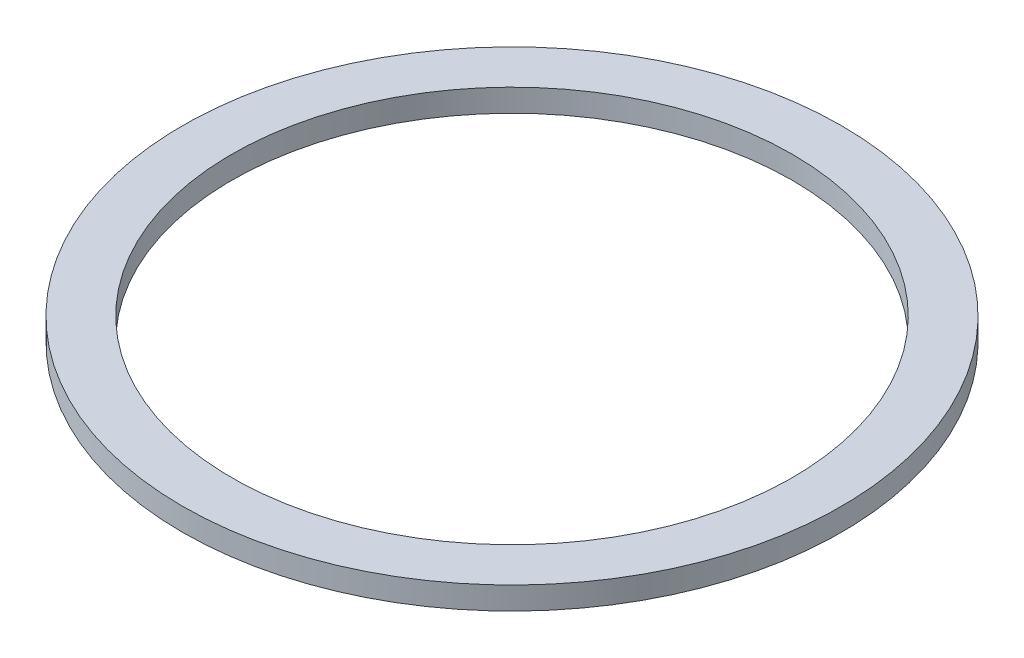
ISO-10303-21;
HEADER;
FILE_DESCRIPTION(('STEP AP214'),'2;1');
FILE_NAME('part.step','',(''),(''),'','','');
FILE_SCHEMA(('AUTOMOTIVE_DESIGN { 1 0 10303 214 1 1 1 1 }'));
ENDSEC;
DATA;
#1=APPLICATION_CONTEXT('core data for automotive mechanical design processes');
#2=APPLICATION_PROTOCOL_DEFINITION('international standard','automotive_design',2000,#1);
#3=PRODUCT_CONTEXT('',#1,'mechanical');
#4=PRODUCT('Part','Part','',(#3));
#5=PRODUCT_RELATED_PRODUCT_CATEGORY('part','',(#4));
#6=PRODUCT_DEFINITION_FORMATION('','',#4);
#7=PRODUCT_DEFINITION_CONTEXT('part definition',#1,'design');
#8=PRODUCT_DEFINITION('design','',#6,#7);
#9=PRODUCT_DEFINITION_SHAPE('','',#8);
#10=(LENGTH_UNIT() NAMED_UNIT(*) SI_UNIT(.MILLI.,.METRE.));
#11=(NAMED_UNIT(*) PLANE_ANGLE_UNIT() SI_UNIT($,.RADIAN.));
#12=(NAMED_UNIT(*) SI_UNIT($,.STERADIAN.) SOLID_ANGLE_UNIT());
#13=UNCERTAINTY_MEASURE_WITH_UNIT(LENGTH_MEASURE(1.E-05),#10,'distance_accuracy_value','');
#14=(GEOMETRIC_REPRESENTATION_CONTEXT(3) GLOBAL_UNCERTAINTY_ASSIGNED_CONTEXT((#13)) GLOBAL_UNIT_ASSIGNED_CONTEXT((#10,
#11,#12)) REPRESENTATION_CONTEXT('',''));
#15=CARTESIAN_POINT('',(0.,0.,0.));
#16=DIRECTION('',(0.,0.,1.));
#17=DIRECTION('',(1.,0.,0.));
#18=AXIS2_PLACEMENT_3D('',#15,#16,#17);
#19=CARTESIAN_POINT('',(0.,1.524,0.));
#20=DIRECTION('',(0.,1.,0.));
#21=DIRECTION('',(0.,0.,1.));
#22=AXIS2_PLACEMENT_3D('',#19,#20,#21);
#23=PLANE('',#22);
#24=CARTESIAN_POINT('',(0.,1.524,0.));
#25=DIRECTION('',(0.,1.,0.));
#26=DIRECTION('',(0.,0.,1.));
#27=AXIS2_PLACEMENT_3D('',#24,#25,#26);
#28=CIRCLE('',#27,22.225);
#29=CARTESIAN_POINT('',(0.,1.524,-22.225));
#30=VERTEX_POINT('',#29);
#31=EDGE_CURVE('E10',#30,#30,#28,.T.);
#32=ORIENTED_EDGE('',*,*,#31,.T.);
#33=EDGE_LOOP('',(#32));
#34=FACE_BOUND('',#33,.T.);
#35=CARTESIAN_POINT('',(0.,1.524,0.));
#36=DIRECTION('',(0.,1.,0.));
#37=DIRECTION('',(0.,0.,1.));
#38=AXIS2_PLACEMENT_3D('',#35,#36,#37);
#39=CIRCLE('',#38,18.8976);
#40=CARTESIAN_POINT('',(0.,1.524,-18.8976));
#41=VERTEX_POINT('',#40);
#42=EDGE_CURVE('E50',#41,#41,#39,.T.);
#43=ORIENTED_EDGE('',*,*,#42,.F.);
#44=EDGE_LOOP('',(#43));
#45=FACE_BOUND('',#44,.T.);
#46=ADVANCED_FACE('F37',(#34,#45),#23,.T.);
#47=CARTESIAN_POINT('',(0.,0.,0.));
#48=DIRECTION('',(0.,1.,0.));
#49=DIRECTION('',(0.,0.,1.));
#50=AXIS2_PLACEMENT_3D('',#47,#48,#49);
#51=PLANE('',#50);
#52=CARTESIAN_POINT('',(0.,0.,0.));
#53=DIRECTION('',(0.,1.,0.));
#54=DIRECTION('',(0.,0.,1.));
#55=AXIS2_PLACEMENT_3D('',#52,#53,#54);
#56=CIRCLE('',#55,22.225);
#57=CARTESIAN_POINT('',(0.,0.,-22.225));
#58=VERTEX_POINT('',#57);
#59=EDGE_CURVE('E41',#58,#58,#56,.T.);
#60=ORIENTED_EDGE('',*,*,#59,.F.);
#61=EDGE_LOOP('',(#60));
#62=FACE_BOUND('',#61,.T.);
#63=CARTESIAN_POINT('',(0.,0.,0.));
#64=DIRECTION('',(0.,1.,0.));
#65=DIRECTION('',(0.,0.,1.));
#66=AXIS2_PLACEMENT_3D('',#63,#64,#65);
#67=CIRCLE('',#66,18.8976);
#68=CARTESIAN_POINT('',(0.,0.,-18.8976));
#69=VERTEX_POINT('',#68);
#70=EDGE_CURVE('E52',#69,#69,#67,.T.);
#71=ORIENTED_EDGE('',*,*,#70,.T.);
#72=EDGE_LOOP('',(#71));
#73=FACE_BOUND('',#72,.T.);
#74=ADVANCED_FACE('F64',(#62,#73),#51,.F.);
#75=CARTESIAN_POINT('',(0.,1.524,0.));
#76=DIRECTION('',(0.,-1.,0.));
#77=DIRECTION('',(0.,0.,-1.));
#78=AXIS2_PLACEMENT_3D('',#75,#76,#77);
#79=CYLINDRICAL_SURFACE('',#78,22.225);
#80=CARTESIAN_POINT('',(0.,1.524,-22.225));
#81=CARTESIAN_POINT('',(0.,1.508125,-22.225));
#82=CARTESIAN_POINT('',(0.,1.49225,-22.225));
#83=CARTESIAN_POINT('',(0.,1.4605,-22.225));
#84=CARTESIAN_POINT('',(0.,1.444625,-22.225));
#85=CARTESIAN_POINT('',(0.,1.412875,-22.225));
#86=CARTESIAN_POINT('',(0.,1.397,-22.225));
#87=CARTESIAN_POINT('',(0.,1.36525,-22.225));
#88=CARTESIAN_POINT('',(0.,1.349375,-22.225));
#89=CARTESIAN_POINT('',(0.,1.317625,-22.225));
#90=CARTESIAN_POINT('',(0.,1.30175,-22.225));
#91=CARTESIAN_POINT('',(0.,1.27,-22.225));
#92=CARTESIAN_POINT('',(0.,1.254125,-22.225));
#93=CARTESIAN_POINT('',(0.,1.222375,-22.225));
#94=CARTESIAN_POINT('',(0.,1.2065,-22.225));
#95=CARTESIAN_POINT('',(0.,1.17475,-22.225));
#96=CARTESIAN_POINT('',(0.,1.158875,-22.225));
#97=CARTESIAN_POINT('',(0.,1.127125,-22.225));
#98=CARTESIAN_POINT('',(0.,1.11125,-22.225));
#99=CARTESIAN_POINT('',(0.,1.0795,-22.225));
#100=CARTESIAN_POINT('',(0.,1.063625,-22.225));
#101=CARTESIAN_POINT('',(0.,1.031875,-22.225));
#102=CARTESIAN_POINT('',(0.,1.016,-22.225));
#103=CARTESIAN_POINT('',(0.,0.98425,-22.225));
#104=CARTESIAN_POINT('',(0.,0.968375,-22.225));
#105=CARTESIAN_POINT('',(0.,0.936625,-22.225));
#106=CARTESIAN_POINT('',(0.,0.92075,-22.225));
#107=CARTESIAN_POINT('',(0.,0.889,-22.225));
#108=CARTESIAN_POINT('',(0.,0.873125,-22.225));
#109=CARTESIAN_POINT('',(0.,0.841375,-22.225));
#110=CARTESIAN_POINT('',(0.,0.8255,-22.225));
#111=CARTESIAN_POINT('',(0.,0.79375,-22.225));
#112=CARTESIAN_POINT('',(0.,0.777875,-22.225));
#113=CARTESIAN_POINT('',(0.,0.746125,-22.225));
#114=CARTESIAN_POINT('',(0.,0.73025,-22.225));
#115=CARTESIAN_POINT('',(0.,0.6985,-22.225));
#116=CARTESIAN_POINT('',(0.,0.682625,-22.225));
#117=CARTESIAN_POINT('',(0.,0.650875,-22.225));
#118=CARTESIAN_POINT('',(0.,0.635,-22.225));
#119=CARTESIAN_POINT('',(0.,0.60325,-22.225));
#120=CARTESIAN_POINT('',(0.,0.587375,-22.225));
#121=CARTESIAN_POINT('',(0.,0.555625,-22.225));
#122=CARTESIAN_POINT('',(0.,0.53975,-22.225));
#123=CARTESIAN_POINT('',(0.,0.508,-22.225));
#124=CARTESIAN_POINT('',(0.,0.492125,-22.225));
#125=CARTESIAN_POINT('',(0.,0.460375,-22.225));
#126=CARTESIAN_POINT('',(0.,0.4445,-22.225));
#127=CARTESIAN_POINT('',(0.,0.41275,-22.225));
#128=CARTESIAN_POINT('',(0.,0.396875,-22.225));
#129=CARTESIAN_POINT('',(0.,0.365125,-22.225));
#130=CARTESIAN_POINT('',(0.,0.34925,-22.225));
#131=CARTESIAN_POINT('',(0.,0.3175,-22.225));
#132=CARTESIAN_POINT('',(0.,0.301625,-22.225));
#133=CARTESIAN_POINT('',(0.,0.269875,-22.225));
#134=CARTESIAN_POINT('',(0.,0.254,-22.225));
#135=CARTESIAN_POINT('',(0.,0.22225,-22.225));
#136=CARTESIAN_POINT('',(0.,0.206375,-22.225));
#137=CARTESIAN_POINT('',(0.,0.174625,-22.225));
#138=CARTESIAN_POINT('',(0.,0.15875,-22.225));
#139=CARTESIAN_POINT('',(0.,0.127,-22.225));
#140=CARTESIAN_POINT('',(0.,0.111125,-22.225));
#141=CARTESIAN_POINT('',(0.,0.079375,-22.225));
#142=CARTESIAN_POINT('',(0.,0.0635,-22.225));
#143=CARTESIAN_POINT('',(0.,0.0317499999999999,-22.225));
#144=CARTESIAN_POINT('',(0.,0.015875,-22.225));
#145=CARTESIAN_POINT('',(0.,0.,-22.225));
#146=B_SPLINE_CURVE_WITH_KNOTS('',3,(#80,#81,#82,#83,#84,#85,#86,#87,#88,#89,#90,#91,#92,#93,
#94,#95,#96,#97,#98,#99,#100,#101,#102,#103,#104,#105,#106,#107,#108,#109,#110,#111,#112,#113,
#114,#115,#116,#117,#118,#119,#120,#121,#122,#123,#124,#125,#126,#127,#128,#129,#130,#131,#132,
#133,#134,#135,#136,#137,#138,#139,#140,#141,#142,#143,#144,#145),.UNSPECIFIED.,.F.,.F.,(4,2,2,
2,2,2,2,2,2,2,2,2,2,2,2,2,2,2,2,2,2,2,2,2,2,2,2,2,2,2,2,2,4),(0.,0.0476250000000001,
0.0952500000000001,0.142875,0.1905,0.238125,0.28575,0.333375,0.381,0.428625,0.47625,0.523875,
0.5715,0.619125,0.66675,0.714375,0.762,0.809625,0.85725,0.904875,0.9525,1.000125,1.04775,
1.095375,1.143,1.190625,1.23825,1.285875,1.3335,1.381125,1.42875,1.476375,1.524),.UNSPECIFIED.);
#147=EDGE_CURVE('BSEAM39',#30,#58,#146,.T.);
#148=ORIENTED_EDGE('',*,*,#31,.F.);
#149=ORIENTED_EDGE('',*,*,#59,.T.);
#150=ORIENTED_EDGE('',*,*,#147,.T.);
#151=ORIENTED_EDGE('',*,*,#147,.F.);
#152=EDGE_LOOP('',(#148,#150,#149,#151));
#153=FACE_BOUND('',#152,.T.);
#154=ADVANCED_FACE('F39',(#153),#79,.T.);
#155=CARTESIAN_POINT('',(0.,1.524,0.));
#156=DIRECTION('',(0.,-1.,0.));
#157=DIRECTION('',(0.,0.,-1.));
#158=AXIS2_PLACEMENT_3D('',#155,#156,#157);
#159=CYLINDRICAL_SURFACE('',#158,18.8976);
#160=CARTESIAN_POINT('',(0.,1.524,-18.8976));
#161=CARTESIAN_POINT('',(0.,1.508125,-18.8976));
#162=CARTESIAN_POINT('',(0.,1.49225,-18.8976));
#163=CARTESIAN_POINT('',(0.,1.4605,-18.8976));
#164=CARTESIAN_POINT('',(0.,1.444625,-18.8976));
#165=CARTESIAN_POINT('',(0.,1.412875,-18.8976));
#166=CARTESIAN_POINT('',(0.,1.397,-18.8976));
#167=CARTESIAN_POINT('',(0.,1.36525,-18.8976));
#168=CARTESIAN_POINT('',(0.,1.349375,-18.8976));
#169=CARTESIAN_POINT('',(0.,1.317625,-18.8976));
#170=CARTESIAN_POINT('',(0.,1.30175,-18.8976));
#171=CARTESIAN_POINT('',(0.,1.27,-18.8976));
#172=CARTESIAN_POINT('',(0.,1.254125,-18.8976));
#173=CARTESIAN_POINT('',(0.,1.222375,-18.8976));
#174=CARTESIAN_POINT('',(0.,1.2065,-18.8976));
#175=CARTESIAN_POINT('',(0.,1.17475,-18.8976));
#176=CARTESIAN_POINT('',(0.,1.158875,-18.8976));
#177=CARTESIAN_POINT('',(0.,1.127125,-18.8976));
#178=CARTESIAN_POINT('',(0.,1.11125,-18.8976));
#179=CARTESIAN_POINT('',(0.,1.0795,-18.8976));
#180=CARTESIAN_POINT('',(0.,1.063625,-18.8976));
#181=CARTESIAN_POINT('',(0.,1.031875,-18.8976));
#182=CARTESIAN_POINT('',(0.,1.016,-18.8976));
#183=CARTESIAN_POINT('',(0.,0.98425,-18.8976));
#184=CARTESIAN_POINT('',(0.,0.968375,-18.8976));
#185=CARTESIAN_POINT('',(0.,0.936625,-18.8976));
#186=CARTESIAN_POINT('',(0.,0.92075,-18.8976));
#187=CARTESIAN_POINT('',(0.,0.889,-18.8976));
#188=CARTESIAN_POINT('',(0.,0.873125,-18.8976));
#189=CARTESIAN_POINT('',(0.,0.841375,-18.8976));
#190=CARTESIAN_POINT('',(0.,0.8255,-18.8976));
#191=CARTESIAN_POINT('',(0.,0.79375,-18.8976));
#192=CARTESIAN_POINT('',(0.,0.777875,-18.8976));
#193=CARTESIAN_POINT('',(0.,0.746125,-18.8976));
#194=CARTESIAN_POINT('',(0.,0.73025,-18.8976));
#195=CARTESIAN_POINT('',(0.,0.6985,-18.8976));
#196=CARTESIAN_POINT('',(0.,0.682625,-18.8976));
#197=CARTESIAN_POINT('',(0.,0.650875,-18.8976));
#198=CARTESIAN_POINT('',(0.,0.635,-18.8976));
#199=CARTESIAN_POINT('',(0.,0.60325,-18.8976));
#200=CARTESIAN_POINT('',(0.,0.587375,-18.8976));
#201=CARTESIAN_POINT('',(0.,0.555625,-18.8976));
#202=CARTESIAN_POINT('',(0.,0.53975,-18.8976));
#203=CARTESIAN_POINT('',(0.,0.508,-18.8976));
#204=CARTESIAN_POINT('',(0.,0.492125,-18.8976));
#205=CARTESIAN_POINT('',(0.,0.460375,-18.8976));
#206=CARTESIAN_POINT('',(0.,0.4445,-18.8976));
#207=CARTESIAN_POINT('',(0.,0.41275,-18.8976));
#208=CARTESIAN_POINT('',(0.,0.396875,-18.8976));
#209=CARTESIAN_POINT('',(0.,0.365125,-18.8976));
#210=CARTESIAN_POINT('',(0.,0.34925,-18.8976));
#211=CARTESIAN_POINT('',(0.,0.3175,-18.8976));
#212=CARTESIAN_POINT('',(0.,0.301625,-18.8976));
#213=CARTESIAN_POINT('',(0.,0.269875,-18.8976));
#214=CARTESIAN_POINT('',(0.,0.254,-18.8976));
#215=CARTESIAN_POINT('',(0.,0.22225,-18.8976));
#216=CARTESIAN_POINT('',(0.,0.206375,-18.8976));
#217=CARTESIAN_POINT('',(0.,0.174625,-18.8976));
#218=CARTESIAN_POINT('',(0.,0.15875,-18.8976));
#219=CARTESIAN_POINT('',(0.,0.127,-18.8976));
#220=CARTESIAN_POINT('',(0.,0.111125,-18.8976));
#221=CARTESIAN_POINT('',(0.,0.079375,-18.8976));
#222=CARTESIAN_POINT('',(0.,0.0635,-18.8976));
#223=CARTESIAN_POINT('',(0.,0.0317499999999999,-18.8976));
#224=CARTESIAN_POINT('',(0.,0.015875,-18.8976));
#225=CARTESIAN_POINT('',(0.,0.,-18.8976));
#226=B_SPLINE_CURVE_WITH_KNOTS('',3,(#160,#161,#162,#163,#164,#165,#166,#167,#168,#169,#170,
#171,#172,#173,#174,#175,#176,#177,#178,#179,#180,#181,#182,#183,#184,#185,#186,#187,#188,#189,
#190,#191,#192,#193,#194,#195,#196,#197,#198,#199,#200,#201,#202,#203,#204,#205,#206,#207,#208,
#209,#210,#211,#212,#213,#214,#215,#216,#217,#218,#219,#220,#221,#222,#223,#224,#225),
.UNSPECIFIED.,.F.,.F.,(4,2,2,2,2,2,2,2,2,2,2,2,2,2,2,2,2,2,2,2,2,2,2,2,2,2,2,2,2,2,2,2,4),(0.,
0.0476249999999999,0.0952499999999998,0.142875,0.1905,0.238125,0.28575,0.333375,0.381,0.428625,
0.47625,0.523875,0.5715,0.619125,0.66675,0.714375,0.762,0.809625,0.85725,0.904875,0.9525,
1.000125,1.04775,1.095375,1.143,1.190625,1.23825,1.285875,1.3335,1.381125,1.42875,1.476375,
1.524),.UNSPECIFIED.);
#227=EDGE_CURVE('BSEAM60',#41,#69,#226,.T.);
#228=ORIENTED_EDGE('',*,*,#42,.T.);
#229=ORIENTED_EDGE('',*,*,#70,.F.);
#230=ORIENTED_EDGE('',*,*,#227,.T.);
#231=ORIENTED_EDGE('',*,*,#227,.F.);
#232=EDGE_LOOP('',(#228,#230,#229,#231));
#233=FACE_BOUND('',#232,.T.);
#234=ADVANCED_FACE('F60',(#233),#159,.F.);
#235=CLOSED_SHELL('',(#46,#74,#154,#234));
#236=MANIFOLD_SOLID_BREP('B2',#235);
#237=ADVANCED_BREP_SHAPE_REPRESENTATION('',(#18,#236),#14);
#238=SHAPE_DEFINITION_REPRESENTATION(#9,#237);
ENDSEC;
END-ISO-10303-21;
